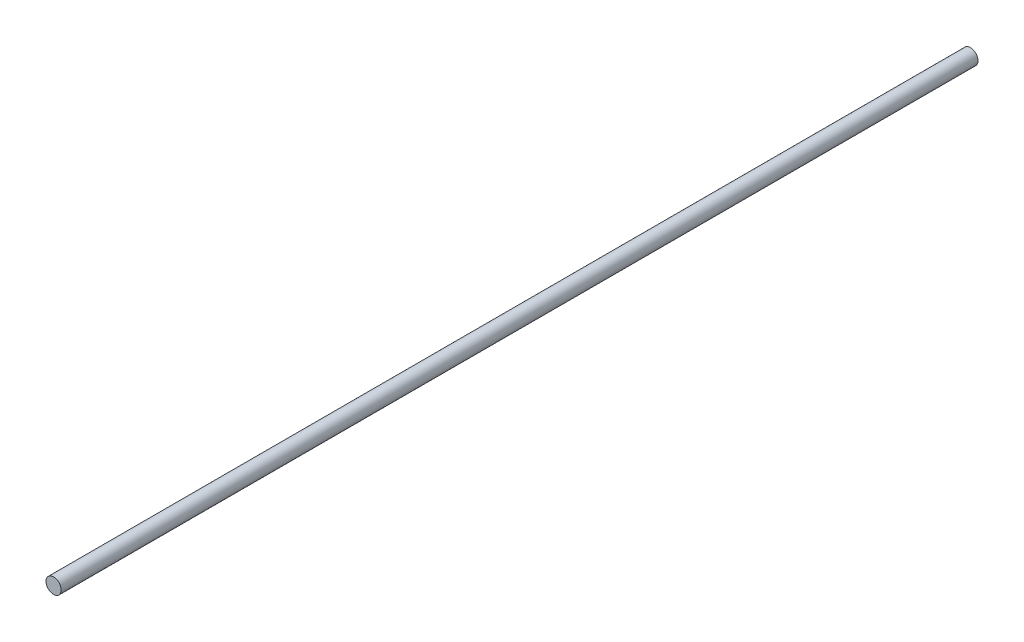
ISO-10303-21;
HEADER;
FILE_DESCRIPTION(('STEP AP214'),'2;1');
FILE_NAME('part.step','',(''),(''),'','','');
FILE_SCHEMA(('AUTOMOTIVE_DESIGN { 1 0 10303 214 1 1 1 1 }'));
ENDSEC;
DATA;
#1=APPLICATION_CONTEXT('core data for automotive mechanical design processes');
#2=APPLICATION_PROTOCOL_DEFINITION('international standard','automotive_design',2000,#1);
#3=PRODUCT_CONTEXT('',#1,'mechanical');
#4=PRODUCT('Part','Part','',(#3));
#5=PRODUCT_RELATED_PRODUCT_CATEGORY('part','',(#4));
#6=PRODUCT_DEFINITION_FORMATION('','',#4);
#7=PRODUCT_DEFINITION_CONTEXT('part definition',#1,'design');
#8=PRODUCT_DEFINITION('design','',#6,#7);
#9=PRODUCT_DEFINITION_SHAPE('','',#8);
#10=(LENGTH_UNIT() NAMED_UNIT(*) SI_UNIT(.MILLI.,.METRE.));
#11=(NAMED_UNIT(*) PLANE_ANGLE_UNIT() SI_UNIT($,.RADIAN.));
#12=(NAMED_UNIT(*) SI_UNIT($,.STERADIAN.) SOLID_ANGLE_UNIT());
#13=UNCERTAINTY_MEASURE_WITH_UNIT(LENGTH_MEASURE(1.E-05),#10,'distance_accuracy_value','');
#14=(GEOMETRIC_REPRESENTATION_CONTEXT(3) GLOBAL_UNCERTAINTY_ASSIGNED_CONTEXT((#13)) GLOBAL_UNIT_ASSIGNED_CONTEXT((#10,
#11,#12)) REPRESENTATION_CONTEXT('',''));
#15=CARTESIAN_POINT('',(0.,0.,0.));
#16=DIRECTION('',(0.,0.,1.));
#17=DIRECTION('',(1.,0.,0.));
#18=AXIS2_PLACEMENT_3D('',#15,#16,#17);
#19=CARTESIAN_POINT('',(0.,0.,102.5));
#20=DIRECTION('',(0.,0.,-1.));
#21=DIRECTION('',(-1.,0.,0.));
#22=AXIS2_PLACEMENT_3D('',#19,#20,#21);
#23=CYLINDRICAL_SURFACE('',#22,1.7);
#24=CARTESIAN_POINT('',(0.,0.,102.5));
#25=DIRECTION('',(0.,0.,1.));
#26=DIRECTION('',(1.,0.,0.));
#27=AXIS2_PLACEMENT_3D('',#24,#25,#26);
#28=CIRCLE('',#27,1.7);
#29=CARTESIAN_POINT('',(-1.7,0.,102.5));
#30=VERTEX_POINT('',#29);
#31=EDGE_CURVE('E10',#30,#30,#28,.T.);
#32=CARTESIAN_POINT('',(0.,0.,-102.5));
#33=DIRECTION('',(0.,0.,1.));
#34=DIRECTION('',(1.,0.,0.));
#35=AXIS2_PLACEMENT_3D('',#32,#33,#34);
#36=CIRCLE('',#35,1.7);
#37=CARTESIAN_POINT('',(-1.7,0.,-102.5));
#38=VERTEX_POINT('',#37);
#39=EDGE_CURVE('E34',#38,#38,#36,.T.);
#40=CARTESIAN_POINT('',(-1.7,0.,102.5));
#41=CARTESIAN_POINT('',(-1.7,0.,100.364583333333));
#42=CARTESIAN_POINT('',(-1.7,0.,98.2291666666667));
#43=CARTESIAN_POINT('',(-1.7,0.,93.9583333333333));
#44=CARTESIAN_POINT('',(-1.7,0.,91.8229166666667));
#45=CARTESIAN_POINT('',(-1.7,0.,87.5520833333333));
#46=CARTESIAN_POINT('',(-1.7,0.,85.4166666666667));
#47=CARTESIAN_POINT('',(-1.7,0.,81.1458333333333));
#48=CARTESIAN_POINT('',(-1.7,0.,79.0104166666667));
#49=CARTESIAN_POINT('',(-1.7,0.,74.7395833333333));
#50=CARTESIAN_POINT('',(-1.7,0.,72.6041666666667));
#51=CARTESIAN_POINT('',(-1.7,0.,68.3333333333333));
#52=CARTESIAN_POINT('',(-1.7,0.,66.1979166666667));
#53=CARTESIAN_POINT('',(-1.7,0.,61.9270833333333));
#54=CARTESIAN_POINT('',(-1.7,0.,59.7916666666667));
#55=CARTESIAN_POINT('',(-1.7,0.,55.5208333333333));
#56=CARTESIAN_POINT('',(-1.7,0.,53.3854166666667));
#57=CARTESIAN_POINT('',(-1.7,0.,49.1145833333333));
#58=CARTESIAN_POINT('',(-1.7,0.,46.9791666666667));
#59=CARTESIAN_POINT('',(-1.7,0.,42.7083333333333));
#60=CARTESIAN_POINT('',(-1.7,0.,40.5729166666667));
#61=CARTESIAN_POINT('',(-1.7,0.,36.3020833333333));
#62=CARTESIAN_POINT('',(-1.7,0.,34.1666666666667));
#63=CARTESIAN_POINT('',(-1.7,0.,29.8958333333333));
#64=CARTESIAN_POINT('',(-1.7,0.,27.7604166666667));
#65=CARTESIAN_POINT('',(-1.7,0.,23.4895833333333));
#66=CARTESIAN_POINT('',(-1.7,0.,21.3541666666667));
#67=CARTESIAN_POINT('',(-1.7,0.,17.0833333333333));
#68=CARTESIAN_POINT('',(-1.7,0.,14.9479166666667));
#69=CARTESIAN_POINT('',(-1.7,0.,10.6770833333333));
#70=CARTESIAN_POINT('',(-1.7,0.,8.54166666666667));
#71=CARTESIAN_POINT('',(-1.7,0.,4.27083333333333));
#72=CARTESIAN_POINT('',(-1.7,0.,2.13541666666667));
#73=CARTESIAN_POINT('',(-1.7,0.,-2.13541666666667));
#74=CARTESIAN_POINT('',(-1.7,0.,-4.27083333333333));
#75=CARTESIAN_POINT('',(-1.7,0.,-8.54166666666667));
#76=CARTESIAN_POINT('',(-1.7,0.,-10.6770833333333));
#77=CARTESIAN_POINT('',(-1.7,0.,-14.9479166666667));
#78=CARTESIAN_POINT('',(-1.7,0.,-17.0833333333333));
#79=CARTESIAN_POINT('',(-1.7,0.,-21.3541666666667));
#80=CARTESIAN_POINT('',(-1.7,0.,-23.4895833333333));
#81=CARTESIAN_POINT('',(-1.7,0.,-27.7604166666667));
#82=CARTESIAN_POINT('',(-1.7,0.,-29.8958333333333));
#83=CARTESIAN_POINT('',(-1.7,0.,-34.1666666666667));
#84=CARTESIAN_POINT('',(-1.7,0.,-36.3020833333333));
#85=CARTESIAN_POINT('',(-1.7,0.,-40.5729166666667));
#86=CARTESIAN_POINT('',(-1.7,0.,-42.7083333333333));
#87=CARTESIAN_POINT('',(-1.7,0.,-46.9791666666667));
#88=CARTESIAN_POINT('',(-1.7,0.,-49.1145833333333));
#89=CARTESIAN_POINT('',(-1.7,0.,-53.3854166666666));
#90=CARTESIAN_POINT('',(-1.7,0.,-55.5208333333333));
#91=CARTESIAN_POINT('',(-1.7,0.,-59.7916666666666));
#92=CARTESIAN_POINT('',(-1.7,0.,-61.9270833333333));
#93=CARTESIAN_POINT('',(-1.7,0.,-66.1979166666666));
#94=CARTESIAN_POINT('',(-1.7,0.,-68.3333333333333));
#95=CARTESIAN_POINT('',(-1.7,0.,-72.6041666666667));
#96=CARTESIAN_POINT('',(-1.7,0.,-74.7395833333333));
#97=CARTESIAN_POINT('',(-1.7,0.,-79.0104166666667));
#98=CARTESIAN_POINT('',(-1.7,0.,-81.1458333333333));
#99=CARTESIAN_POINT('',(-1.7,0.,-85.4166666666667));
#100=CARTESIAN_POINT('',(-1.7,0.,-87.5520833333333));
#101=CARTESIAN_POINT('',(-1.7,0.,-91.8229166666667));
#102=CARTESIAN_POINT('',(-1.7,0.,-93.9583333333333));
#103=CARTESIAN_POINT('',(-1.7,0.,-98.2291666666667));
#104=CARTESIAN_POINT('',(-1.7,0.,-100.364583333333));
#105=CARTESIAN_POINT('',(-1.7,0.,-102.5));
#106=B_SPLINE_CURVE_WITH_KNOTS('',3,(#40,#41,#42,#43,#44,#45,#46,#47,#48,#49,#50,#51,#52,#53,
#54,#55,#56,#57,#58,#59,#60,#61,#62,#63,#64,#65,#66,#67,#68,#69,#70,#71,#72,#73,#74,#75,#76,#77,
#78,#79,#80,#81,#82,#83,#84,#85,#86,#87,#88,#89,#90,#91,#92,#93,#94,#95,#96,#97,#98,#99,#100,
#101,#102,#103,#104,#105),.UNSPECIFIED.,.F.,.F.,(4,2,2,2,2,2,2,2,2,2,2,2,2,2,2,2,2,2,2,2,2,2,2,
2,2,2,2,2,2,2,2,2,4),(0.,6.40625,12.8125,19.21875,25.625,32.03125,38.4375,44.84375,51.25,
57.65625,64.0625,70.46875,76.875,83.28125,89.6875,96.09375,102.5,108.90625,115.3125,121.71875,
128.125,134.53125,140.9375,147.34375,153.75,160.15625,166.5625,172.96875,179.375,185.78125,
192.1875,198.59375,205.),.UNSPECIFIED.);
#107=EDGE_CURVE('BSEAM31',#30,#38,#106,.T.);
#108=ORIENTED_EDGE('',*,*,#31,.F.);
#109=ORIENTED_EDGE('',*,*,#39,.T.);
#110=ORIENTED_EDGE('',*,*,#107,.T.);
#111=ORIENTED_EDGE('',*,*,#107,.F.);
#112=EDGE_LOOP('',(#108,#110,#109,#111));
#113=FACE_BOUND('',#112,.T.);
#114=ADVANCED_FACE('F31',(#113),#23,.T.);
#115=CARTESIAN_POINT('',(0.,0.,102.5));
#116=DIRECTION('',(0.,0.,1.));
#117=DIRECTION('',(1.,0.,0.));
#118=AXIS2_PLACEMENT_3D('',#115,#116,#117);
#119=PLANE('',#118);
#120=ORIENTED_EDGE('',*,*,#31,.T.);
#121=EDGE_LOOP('',(#120));
#122=FACE_BOUND('',#121,.T.);
#123=ADVANCED_FACE('F46',(#122),#119,.T.);
#124=CARTESIAN_POINT('',(0.,0.,-102.5));
#125=DIRECTION('',(0.,0.,1.));
#126=DIRECTION('',(1.,0.,0.));
#127=AXIS2_PLACEMENT_3D('',#124,#125,#126);
#128=PLANE('',#127);
#129=ORIENTED_EDGE('',*,*,#39,.F.);
#130=EDGE_LOOP('',(#129));
#131=FACE_BOUND('',#130,.T.);
#132=ADVANCED_FACE('F44',(#131),#128,.F.);
#133=CLOSED_SHELL('',(#114,#123,#132));
#134=MANIFOLD_SOLID_BREP('B2',#133);
#135=ADVANCED_BREP_SHAPE_REPRESENTATION('',(#18,#134),#14);
#136=SHAPE_DEFINITION_REPRESENTATION(#9,#135);
ENDSEC;
END-ISO-10303-21;
